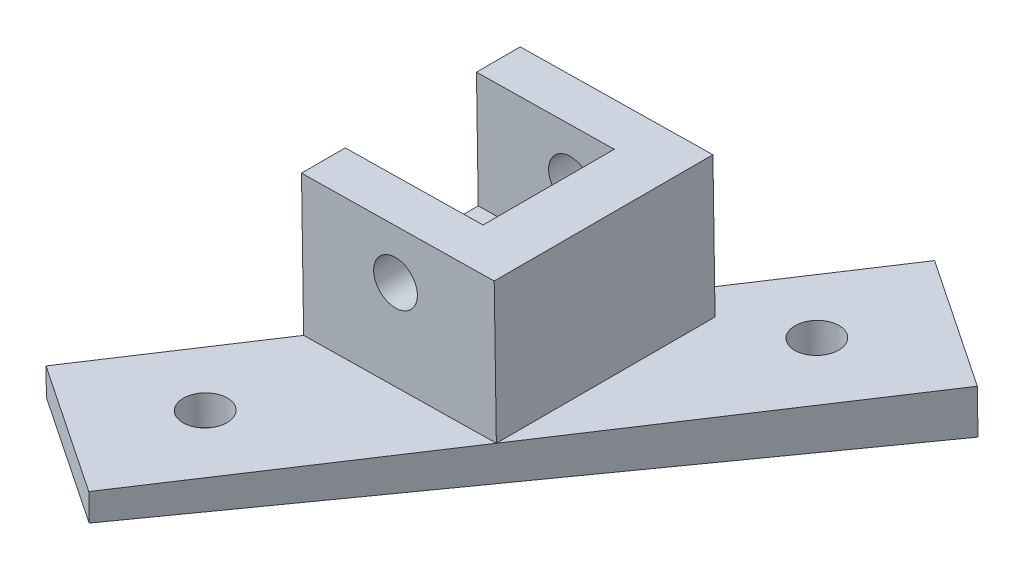
ISO-10303-21;
HEADER;
FILE_DESCRIPTION(('STEP AP214'),'2;1');
FILE_NAME('part.step','',(''),(''),'','','');
FILE_SCHEMA(('AUTOMOTIVE_DESIGN { 1 0 10303 214 1 1 1 1 }'));
ENDSEC;
DATA;
#1=APPLICATION_CONTEXT('core data for automotive mechanical design processes');
#2=APPLICATION_PROTOCOL_DEFINITION('international standard','automotive_design',2000,#1);
#3=PRODUCT_CONTEXT('',#1,'mechanical');
#4=PRODUCT('Part','Part','',(#3));
#5=PRODUCT_RELATED_PRODUCT_CATEGORY('part','',(#4));
#6=PRODUCT_DEFINITION_FORMATION('','',#4);
#7=PRODUCT_DEFINITION_CONTEXT('part definition',#1,'design');
#8=PRODUCT_DEFINITION('design','',#6,#7);
#9=PRODUCT_DEFINITION_SHAPE('','',#8);
#10=(LENGTH_UNIT() NAMED_UNIT(*) SI_UNIT(.MILLI.,.METRE.));
#11=(NAMED_UNIT(*) PLANE_ANGLE_UNIT() SI_UNIT($,.RADIAN.));
#12=(NAMED_UNIT(*) SI_UNIT($,.STERADIAN.) SOLID_ANGLE_UNIT());
#13=UNCERTAINTY_MEASURE_WITH_UNIT(LENGTH_MEASURE(1.E-05),#10,'distance_accuracy_value','');
#14=(GEOMETRIC_REPRESENTATION_CONTEXT(3) GLOBAL_UNCERTAINTY_ASSIGNED_CONTEXT((#13)) GLOBAL_UNIT_ASSIGNED_CONTEXT((#10,
#11,#12)) REPRESENTATION_CONTEXT('',''));
#15=CARTESIAN_POINT('',(0.,0.,0.));
#16=DIRECTION('',(0.,0.,1.));
#17=DIRECTION('',(1.,0.,0.));
#18=AXIS2_PLACEMENT_3D('',#15,#16,#17);
#19=CARTESIAN_POINT('',(670.82874810373,83.3624792084025,-35.299010508258));
#20=DIRECTION('',(-0.560297095045979,-0.00855440103428425,0.828247539993921));
#21=DIRECTION('',(0.828277846314157,0.,0.560317596819145));
#22=AXIS2_PLACEMENT_3D('',#19,#20,#21);
#23=PLANE('',#22);
#24=DIRECTION('',(0.82815102457222,0.0126438920418868,0.560362393897035));
#25=VECTOR('',#24,1.);
#26=CARTESIAN_POINT('',(615.807262305805,84.0479670139401,-72.5131442445612));
#27=LINE('',#26,#25);
#28=CARTESIAN_POINT('',(651.613852575449,84.5946482934704,-48.2848742244251));
#29=VERTEX_POINT('',#28);
#30=CARTESIAN_POINT('',(670.805462252731,84.8876584252817,-35.299010508258));
#31=VERTEX_POINT('',#30);
#32=EDGE_CURVE('E50',#29,#31,#27,.T.);
#33=ORIENTED_EDGE('',*,*,#32,.F.);
#34=DIRECTION('',(-0.0152658371215683,0.999883470318906,0.));
#35=VECTOR('',#34,1.);
#36=CARTESIAN_POINT('',(651.637138426448,83.0694690765912,-48.2848742244251));
#37=LINE('',#36,#35);
#38=CARTESIAN_POINT('',(651.516935224953,90.9425515218822,-48.2848742244251));
#39=VERTEX_POINT('',#38);
#40=EDGE_CURVE('E178',#29,#39,#37,.T.);
#41=ORIENTED_EDGE('',*,*,#40,.T.);
#42=DIRECTION('',(0.828151024572218,0.0126438920418868,0.560362393897037));
#43=VECTOR('',#42,1.);
#44=CARTESIAN_POINT('',(670.708544902235,91.2355616536936,-35.299010508258));
#45=LINE('',#44,#43);
#46=CARTESIAN_POINT('',(670.708544902235,91.2355616536936,-35.299010508258));
#47=VERTEX_POINT('',#46);
#48=EDGE_CURVE('E175',#39,#47,#45,.T.);
#49=ORIENTED_EDGE('',*,*,#48,.T.);
#50=DIRECTION('',(-0.0152658371215683,0.999883470318906,0.));
#51=VECTOR('',#50,1.);
#52=CARTESIAN_POINT('',(670.82874810373,83.3624792084025,-35.299010508258));
#53=LINE('',#52,#51);
#54=EDGE_CURVE('E44',#31,#47,#53,.T.);
#55=ORIENTED_EDGE('',*,*,#54,.F.);
#56=EDGE_LOOP('',(#33,#41,#49,#55));
#57=FACE_BOUND('',#56,.T.);
#58=ADVANCED_FACE('F41',(#57),#23,.F.);
#59=CARTESIAN_POINT('',(618.777594974256,82.5677821769465,41.6445251882739));
#60=DIRECTION('',(-0.82815102457222,-0.0126438920418868,-0.560362393897035));
#61=DIRECTION('',(-0.560407191277623,0.,0.828217229936884));
#62=AXIS2_PLACEMENT_3D('',#59,#60,#61);
#63=PLANE('',#62);
#64=DIRECTION('',(-0.0152658371215683,0.999883470318906,0.));
#65=VECTOR('',#64,1.);
#66=CARTESIAN_POINT('',(618.777594974256,82.5677821769465,41.6445251882739));
#67=LINE('',#66,#65);
#68=CARTESIAN_POINT('',(618.717546662543,86.5008330685791,41.6445251882738));
#69=VERTEX_POINT('',#68);
#70=CARTESIAN_POINT('',(618.657391772761,90.4408646222376,41.6445251882739));
#71=VERTEX_POINT('',#70);
#72=EDGE_CURVE('E149',#69,#71,#67,.T.);
#73=ORIENTED_EDGE('',*,*,#72,.F.);
#74=DIRECTION('',(-0.560504532319102,0.0173589533915006,0.827969405223946));
#75=VECTOR('',#74,1.);
#76=CARTESIAN_POINT('',(618.717546662543,86.5008330685791,41.6445251882738));
#77=LINE('',#76,#75);
#78=EDGE_CURVE('E11',#31,#69,#77,.T.);
#79=ORIENTED_EDGE('',*,*,#78,.F.);
#80=ORIENTED_EDGE('',*,*,#54,.T.);
#81=DIRECTION('',(-0.560297095045977,-0.00855440103428422,0.828247539993922));
#82=VECTOR('',#81,1.);
#83=CARTESIAN_POINT('',(618.657391772761,90.4408646222376,41.6445251882739));
#84=LINE('',#83,#82);
#85=CARTESIAN_POINT('',(642.533611114339,90.8053975766938,6.35));
#86=VERTEX_POINT('',#85);
#87=EDGE_CURVE('E173',#47,#86,#84,.T.);
#88=ORIENTED_EDGE('',*,*,#87,.T.);
#89=EDGE_CURVE('E157',#86,#71,#84,.T.);
#90=ORIENTED_EDGE('',*,*,#89,.T.);
#91=EDGE_LOOP('',(#73,#79,#80,#88,#90));
#92=FACE_BOUND('',#91,.T.);
#93=ADVANCED_FACE('F154',(#92),#63,.F.);
#94=CARTESIAN_POINT('',(614.677461713889,82.5051829157451,6.35));
#95=DIRECTION('',(0.828151024572219,0.0126438920418868,0.560362393897037));
#96=DIRECTION('',(0.560407191277625,0.,-0.828217229936883));
#97=AXIS2_PLACEMENT_3D('',#94,#95,#96);
#98=PLANE('',#97);
#99=ORIENTED_EDGE('',*,*,#40,.F.);
#100=DIRECTION('',(-0.560504532319104,0.0173589533915005,0.827969405223946));
#101=VECTOR('',#100,1.);
#102=CARTESIAN_POINT('',(614.675063702372,85.7386510221069,6.28058473161884));
#103=LINE('',#102,#101);
#104=CARTESIAN_POINT('',(599.525936985262,86.2078229367678,28.6586614721068));
#105=VERTEX_POINT('',#104);
#106=EDGE_CURVE('E58',#29,#105,#103,.T.);
#107=ORIENTED_EDGE('',*,*,#106,.T.);
#108=DIRECTION('',(-0.0152658371215683,0.999883470318906,0.));
#109=VECTOR('',#108,1.);
#110=CARTESIAN_POINT('',(599.585985296975,82.2747720451352,28.6586614721068));
#111=LINE('',#110,#109);
#112=CARTESIAN_POINT('',(599.46578209548,90.1478544904263,28.6586614721068));
#113=VERTEX_POINT('',#112);
#114=EDGE_CURVE('E151',#105,#113,#111,.T.);
#115=ORIENTED_EDGE('',*,*,#114,.T.);
#116=DIRECTION('',(0.560297095045979,0.00855440103428426,-0.828247539993921));
#117=VECTOR('',#116,1.);
#118=CARTESIAN_POINT('',(614.557258512394,90.3782653610361,6.35));
#119=LINE('',#118,#117);
#120=CARTESIAN_POINT('',(614.557258512394,90.3782653610361,6.35));
#121=VERTEX_POINT('',#120);
#122=EDGE_CURVE('E168',#113,#121,#119,.T.);
#123=ORIENTED_EDGE('',*,*,#122,.T.);
#124=CARTESIAN_POINT('',(636.035659483969,90.7061893447772,-25.3999999999998));
#125=VERTEX_POINT('',#124);
#126=EDGE_CURVE('E170',#121,#125,#119,.T.);
#127=ORIENTED_EDGE('',*,*,#126,.T.);
#128=EDGE_CURVE('E171',#125,#39,#119,.T.);
#129=ORIENTED_EDGE('',*,*,#128,.T.);
#130=EDGE_LOOP('',(#99,#107,#115,#123,#127,#129));
#131=FACE_BOUND('',#130,.T.);
#132=ADVANCED_FACE('F197',(#131),#98,.F.);
#133=CARTESIAN_POINT('',(-1.23631912482259,80.9765653272119,-53.8768083630402));
#134=DIRECTION('',(-0.0152658371215682,0.999883470318906,0.));
#135=DIRECTION('',(-0.999883470318906,-0.0152658371215682,0.));
#136=AXIS2_PLACEMENT_3D('',#133,#134,#135);
#137=PLANE('',#136);
#138=ORIENTED_EDGE('',*,*,#126,.F.);
#139=DIRECTION('',(0.,0.,1.));
#140=VECTOR('',#139,1.);
#141=CARTESIAN_POINT('',(614.557258512394,90.3782653610361,-53.8768083630402));
#142=LINE('',#141,#140);
#143=CARTESIAN_POINT('',(614.557258512394,90.3782653610361,-25.3999999999998));
#144=VERTEX_POINT('',#143);
#145=EDGE_CURVE('E235',#144,#121,#142,.T.);
#146=ORIENTED_EDGE('',*,*,#145,.F.);
#147=DIRECTION('',(-0.999883470318906,-0.0152658371215682,0.));
#148=VECTOR('',#147,1.);
#149=CARTESIAN_POINT('',(642.533611114339,90.8053975766938,-25.3999999999998));
#150=LINE('',#149,#148);
#151=EDGE_CURVE('E245',#125,#144,#150,.T.);
#152=ORIENTED_EDGE('',*,*,#151,.F.);
#153=EDGE_LOOP('',(#138,#146,#152));
#154=FACE_BOUND('',#153,.T.);
#155=ADVANCED_FACE('F341',(#154),#137,.F.);
#156=CARTESIAN_POINT('',(-1.29060444162689,84.5321509476659,-53.8768083630402));
#157=DIRECTION('',(0.0152658371215682,-0.999883470318906,0.));
#158=DIRECTION('',(0.999883470318906,0.0152658371215682,0.));
#159=AXIS2_PLACEMENT_3D('',#156,#157,#158);
#160=PLANE('',#159);
#161=DIRECTION('',(0.,0.,1.));
#162=VECTOR('',#161,1.);
#163=CARTESIAN_POINT('',(623.884527878266,94.0770849582326,-53.8768083630402));
#164=LINE('',#163,#162);
#165=CARTESIAN_POINT('',(623.884527878265,94.0770849582326,-19.05));
#166=VERTEX_POINT('',#165);
#167=CARTESIAN_POINT('',(623.884527878266,94.0770849582326,0.));
#168=VERTEX_POINT('',#167);
#169=EDGE_CURVE('E547',#166,#168,#164,.T.);
#170=ORIENTED_EDGE('',*,*,#169,.F.);
#171=DIRECTION('',(-0.999883470318906,-0.0152658371215682,0.));
#172=VECTOR('',#171,1.);
#173=CARTESIAN_POINT('',(-1.29060444162688,84.5321509476659,-19.0499999999998));
#174=LINE('',#173,#172);
#175=CARTESIAN_POINT('',(614.50297319559,93.9338509814902,-19.0499999999999));
#176=VERTEX_POINT('',#175);
#177=EDGE_CURVE('E200',#166,#176,#174,.T.);
#178=ORIENTED_EDGE('',*,*,#177,.T.);
#179=DIRECTION('',(0.,0.,1.));
#180=VECTOR('',#179,1.);
#181=CARTESIAN_POINT('',(614.50297319559,93.9338509814902,-53.8768083630402));
#182=LINE('',#181,#180);
#183=CARTESIAN_POINT('',(614.50297319559,93.9338509814902,0.));
#184=VERTEX_POINT('',#183);
#185=EDGE_CURVE('E563',#176,#184,#182,.T.);
#186=ORIENTED_EDGE('',*,*,#185,.T.);
#187=DIRECTION('',(0.999883470318906,0.0152658371215682,0.));
#188=VECTOR('',#187,1.);
#189=CARTESIAN_POINT('',(-1.29060444162689,84.5321509476659,0.));
#190=LINE('',#189,#188);
#191=EDGE_CURVE('E236',#184,#168,#190,.T.);
#192=ORIENTED_EDGE('',*,*,#191,.T.);
#193=EDGE_LOOP('',(#170,#178,#186,#192));
#194=FACE_BOUND('',#193,.T.);
#195=ADVANCED_FACE('F345',(#194),#160,.F.);
#196=CARTESIAN_POINT('',(615.793577637217,9.40170003382415,-53.8768083630402));
#197=DIRECTION('',(0.999883470318906,0.0152658371215681,0.));
#198=DIRECTION('',(-0.0152658371215681,0.999883470318906,0.));
#199=AXIS2_PLACEMENT_3D('',#196,#197,#198);
#200=PLANE('',#199);
#201=ORIENTED_EDGE('',*,*,#185,.F.);
#202=DIRECTION('',(-0.0152658371215681,0.999883470318906,0.));
#203=VECTOR('',#202,1.);
#204=CARTESIAN_POINT('',(614.557258512394,90.3782653610361,-19.0499999999998));
#205=LINE('',#204,#203);
#206=CARTESIAN_POINT('',(614.248219958873,110.619706357478,-19.0499999999998));
#207=VERTEX_POINT('',#206);
#208=EDGE_CURVE('E233',#176,#207,#205,.T.);
#209=ORIENTED_EDGE('',*,*,#208,.T.);
#210=DIRECTION('',(0.,0.,1.));
#211=VECTOR('',#210,1.);
#212=CARTESIAN_POINT('',(614.248219958873,110.619706357478,-25.3999999999998));
#213=LINE('',#212,#211);
#214=CARTESIAN_POINT('',(614.248219958873,110.619706357478,-25.3999999999998));
#215=VERTEX_POINT('',#214);
#216=EDGE_CURVE('E225',#215,#207,#213,.T.);
#217=ORIENTED_EDGE('',*,*,#216,.F.);
#218=DIRECTION('',(-0.0152658371215681,0.999883470318906,0.));
#219=VECTOR('',#218,1.);
#220=CARTESIAN_POINT('',(614.557258512394,90.3782653610361,-25.3999999999998));
#221=LINE('',#220,#219);
#222=EDGE_CURVE('E243',#144,#215,#221,.T.);
#223=ORIENTED_EDGE('',*,*,#222,.F.);
#224=ORIENTED_EDGE('',*,*,#145,.T.);
#225=DIRECTION('',(-0.0152658371215681,0.999883470318906,0.));
#226=VECTOR('',#225,1.);
#227=CARTESIAN_POINT('',(614.557258512394,90.3782653610361,6.35));
#228=LINE('',#227,#226);
#229=CARTESIAN_POINT('',(614.248219958873,110.619706357478,6.35));
#230=VERTEX_POINT('',#229);
#231=EDGE_CURVE('E221',#121,#230,#228,.T.);
#232=ORIENTED_EDGE('',*,*,#231,.T.);
#233=DIRECTION('',(0.,0.,-1.));
#234=VECTOR('',#233,1.);
#235=CARTESIAN_POINT('',(614.248219958873,110.619706357478,6.35));
#236=LINE('',#235,#234);
#237=CARTESIAN_POINT('',(614.248219958873,110.619706357478,0.));
#238=VERTEX_POINT('',#237);
#239=EDGE_CURVE('E587',#230,#238,#236,.T.);
#240=ORIENTED_EDGE('',*,*,#239,.T.);
#241=DIRECTION('',(-0.0152658371215681,0.999883470318906,0.));
#242=VECTOR('',#241,1.);
#243=CARTESIAN_POINT('',(614.557258512394,90.3782653610361,0.));
#244=LINE('',#243,#242);
#245=EDGE_CURVE('E592',#184,#238,#244,.T.);
#246=ORIENTED_EDGE('',*,*,#245,.F.);
#247=EDGE_LOOP('',(#201,#209,#217,#223,#224,#232,#240,#246));
#248=FACE_BOUND('',#247,.T.);
#249=ADVANCED_FACE('F378',(#248),#200,.F.);
#250=CARTESIAN_POINT('',(643.769930239162,9.82883224948189,-53.8768083630402));
#251=DIRECTION('',(-0.999883470318906,-0.0152658371215681,0.));
#252=DIRECTION('',(0.0152658371215681,-0.999883470318906,0.));
#253=AXIS2_PLACEMENT_3D('',#250,#251,#252);
#254=PLANE('',#253);
#255=DIRECTION('',(0.,0.,1.));
#256=VECTOR('',#255,1.);
#257=CARTESIAN_POINT('',(642.533611114339,90.8053975766938,-53.8768083630402));
#258=LINE('',#257,#256);
#259=CARTESIAN_POINT('',(642.533611114339,90.8053975766938,-25.3999999999998));
#260=VERTEX_POINT('',#259);
#261=EDGE_CURVE('E152',#260,#86,#258,.T.);
#262=ORIENTED_EDGE('',*,*,#261,.F.);
#263=DIRECTION('',(0.0152658371215681,-0.999883470318906,0.));
#264=VECTOR('',#263,1.);
#265=CARTESIAN_POINT('',(642.224572560817,111.046838573136,-25.3999999999998));
#266=LINE('',#265,#264);
#267=CARTESIAN_POINT('',(642.224572560817,111.046838573136,-25.3999999999998));
#268=VERTEX_POINT('',#267);
#269=EDGE_CURVE('E237',#268,#260,#266,.T.);
#270=ORIENTED_EDGE('',*,*,#269,.F.);
#271=DIRECTION('',(0.,0.,1.));
#272=VECTOR('',#271,1.);
#273=CARTESIAN_POINT('',(642.224572560818,111.046838573136,-53.8768083630402));
#274=LINE('',#273,#272);
#275=CARTESIAN_POINT('',(642.224572560817,111.046838573136,6.35));
#276=VERTEX_POINT('',#275);
#277=EDGE_CURVE('E226',#268,#276,#274,.T.);
#278=ORIENTED_EDGE('',*,*,#277,.T.);
#279=DIRECTION('',(0.0152658371215681,-0.999883470318906,0.));
#280=VECTOR('',#279,1.);
#281=CARTESIAN_POINT('',(642.224572560817,111.046838573136,6.35));
#282=LINE('',#281,#280);
#283=EDGE_CURVE('E223',#276,#86,#282,.T.);
#284=ORIENTED_EDGE('',*,*,#283,.T.);
#285=EDGE_LOOP('',(#262,#270,#278,#284));
#286=FACE_BOUND('',#285,.T.);
#287=ADVANCED_FACE('F389',(#286),#254,.F.);
#288=CARTESIAN_POINT('',(-1.54535767834411,101.218006323654,-53.8768083630402));
#289=DIRECTION('',(0.0152658371215673,-0.999883470318906,0.));
#290=DIRECTION('',(0.999883470318906,0.0152658371215673,0.));
#291=AXIS2_PLACEMENT_3D('',#288,#289,#290);
#292=PLANE('',#291);
#293=ORIENTED_EDGE('',*,*,#277,.F.);
#294=DIRECTION('',(0.999883470318906,0.0152658371215677,0.));
#295=VECTOR('',#294,1.);
#296=CARTESIAN_POINT('',(614.248219958873,110.619706357478,-25.3999999999998));
#297=LINE('',#296,#295);
#298=EDGE_CURVE('E240',#215,#268,#297,.T.);
#299=ORIENTED_EDGE('',*,*,#298,.F.);
#300=ORIENTED_EDGE('',*,*,#216,.T.);
#301=DIRECTION('',(0.999883470318906,0.0152658371215677,0.));
#302=VECTOR('',#301,1.);
#303=CARTESIAN_POINT('',(614.248219958873,110.619706357478,-19.0499999999998));
#304=LINE('',#303,#302);
#305=CARTESIAN_POINT('',(634.25254540357,110.925124721748,-19.05));
#306=VERTEX_POINT('',#305);
#307=EDGE_CURVE('E229',#207,#306,#304,.T.);
#308=ORIENTED_EDGE('',*,*,#307,.T.);
#309=DIRECTION('',(0.,0.,1.));
#310=VECTOR('',#309,1.);
#311=CARTESIAN_POINT('',(634.25254540357,110.925124721748,-53.8768083630402));
#312=LINE('',#311,#310);
#313=CARTESIAN_POINT('',(634.25254540357,110.925124721748,0.));
#314=VERTEX_POINT('',#313);
#315=EDGE_CURVE('E232',#306,#314,#312,.T.);
#316=ORIENTED_EDGE('',*,*,#315,.T.);
#317=DIRECTION('',(0.999883470318906,0.0152658371215682,0.));
#318=VECTOR('',#317,1.);
#319=CARTESIAN_POINT('',(614.248219958873,110.619706357478,0.));
#320=LINE('',#319,#318);
#321=EDGE_CURVE('E594',#238,#314,#320,.T.);
#322=ORIENTED_EDGE('',*,*,#321,.F.);
#323=ORIENTED_EDGE('',*,*,#239,.F.);
#324=DIRECTION('',(0.999883470318906,0.0152658371215682,0.));
#325=VECTOR('',#324,1.);
#326=CARTESIAN_POINT('',(614.248219958873,110.619706357478,6.35));
#327=LINE('',#326,#325);
#328=EDGE_CURVE('E283',#230,#276,#327,.T.);
#329=ORIENTED_EDGE('',*,*,#328,.T.);
#330=EDGE_LOOP('',(#293,#299,#300,#308,#316,#322,#323,#329));
#331=FACE_BOUND('',#330,.T.);
#332=ADVANCED_FACE('F400',(#331),#292,.F.);
#333=CARTESIAN_POINT('',(627.893070479448,103.664395922966,-53.8768083630402));
#334=DIRECTION('',(0.,0.,1.));
#335=DIRECTION('',(1.,0.,0.));
#336=AXIS2_PLACEMENT_3D('',#333,#334,#335);
#337=CYLINDRICAL_SURFACE('',#336,9.65200000000007);
#338=CARTESIAN_POINT('',(627.893070479448,103.664395922966,-19.05));
#339=DIRECTION('',(0.,0.,1.));
#340=DIRECTION('',(1.,0.,0.));
#341=AXIS2_PLACEMENT_3D('',#338,#339,#340);
#342=CIRCLE('',#341,9.65200000000007);
#343=CARTESIAN_POINT('',(630.810820972356,94.463970059935,-19.05));
#344=VERTEX_POINT('',#343);
#345=EDGE_CURVE('E251',#344,#306,#342,.T.);
#346=ORIENTED_EDGE('',*,*,#345,.F.);
#347=DIRECTION('',(0.,0.,1.));
#348=VECTOR('',#347,1.);
#349=CARTESIAN_POINT('',(630.810820972356,94.4639700599349,-53.8768083630402));
#350=LINE('',#349,#348);
#351=CARTESIAN_POINT('',(630.810820972356,94.4639700599349,0.));
#352=VERTEX_POINT('',#351);
#353=EDGE_CURVE('E275',#344,#352,#350,.T.);
#354=ORIENTED_EDGE('',*,*,#353,.T.);
#355=CARTESIAN_POINT('',(627.893070479448,103.664395922966,0.));
#356=DIRECTION('',(0.,0.,1.));
#357=DIRECTION('',(1.,0.,0.));
#358=AXIS2_PLACEMENT_3D('',#355,#356,#357);
#359=CIRCLE('',#358,9.65200000000007);
#360=EDGE_CURVE('E252',#314,#352,#359,.F.);
#361=ORIENTED_EDGE('',*,*,#360,.F.);
#362=ORIENTED_EDGE('',*,*,#315,.F.);
#363=EDGE_LOOP('',(#346,#354,#361,#362));
#364=FACE_BOUND('',#363,.T.);
#365=ADVANCED_FACE('F286',(#364),#337,.F.);
#366=CARTESIAN_POINT('',(-1.29489573492162,84.8132225466757,-53.8768083630402));
#367=DIRECTION('',(0.0152658371213527,-0.999883470318909,0.));
#368=DIRECTION('',(0.999883470318909,0.0152658371213527,0.));
#369=AXIS2_PLACEMENT_3D('',#366,#367,#368);
#370=PLANE('',#369);
#371=ORIENTED_EDGE('',*,*,#353,.F.);
#372=DIRECTION('',(-0.999883470318909,-0.0152658371213527,0.));
#373=VECTOR('',#372,1.);
#374=CARTESIAN_POINT('',(-1.29489573492161,84.8132225466757,-19.0499999999998));
#375=LINE('',#374,#373);
#376=CARTESIAN_POINT('',(628.03418628472,94.4215774670526,-19.05));
#377=VERTEX_POINT('',#376);
#378=EDGE_CURVE('E265',#344,#377,#375,.T.);
#379=ORIENTED_EDGE('',*,*,#378,.T.);
#380=DIRECTION('',(0.,0.,1.));
#381=VECTOR('',#380,1.);
#382=CARTESIAN_POINT('',(628.03418628472,94.4215774670526,-53.8768083630402));
#383=LINE('',#382,#381);
#384=CARTESIAN_POINT('',(628.03418628472,94.4215774670526,0.));
#385=VERTEX_POINT('',#384);
#386=EDGE_CURVE('E274',#377,#385,#383,.T.);
#387=ORIENTED_EDGE('',*,*,#386,.T.);
#388=DIRECTION('',(0.999883470318909,0.0152658371213527,0.));
#389=VECTOR('',#388,1.);
#390=CARTESIAN_POINT('',(-1.29489573492162,84.8132225466757,0.));
#391=LINE('',#390,#389);
#392=EDGE_CURVE('E280',#385,#352,#391,.T.);
#393=ORIENTED_EDGE('',*,*,#392,.T.);
#394=EDGE_LOOP('',(#371,#379,#387,#393));
#395=FACE_BOUND('',#394,.T.);
#396=ADVANCED_FACE('F279',(#395),#370,.F.);
#397=CARTESIAN_POINT('',(623.884527878266,94.0770849582326,-53.8768083630402));
#398=CARTESIAN_POINT('',(624.2014691757,94.0819238963363,-53.8768083630402));
#399=CARTESIAN_POINT('',(624.526518619728,94.1078590761953,-53.8768083630402));
#400=CARTESIAN_POINT('',(625.19407181114,94.1761616374886,-53.8768083630402));
#401=CARTESIAN_POINT('',(625.538291649457,94.2189712483052,-53.8768083630402));
#402=CARTESIAN_POINT('',(626.237801829782,94.3006977426931,-53.8768083630402));
#403=CARTESIAN_POINT('',(626.591177817197,94.3392819538361,-53.8768083630402));
#404=CARTESIAN_POINT('',(627.30622806958,94.3969858185991,-53.8768083630402));
#405=CARTESIAN_POINT('',(627.667912536219,94.4159853400167,-53.8768083630402));
#406=CARTESIAN_POINT('',(628.03418628472,94.421577467052,-53.8768083630402));
#407=B_SPLINE_CURVE_WITH_KNOTS('',3,(#397,#398,#399,#400,#401,#402,#403,#404,#405,#406),
.UNSPECIFIED.,.F.,.F.,(4,2,2,2,4),(0.,0.25,0.5,0.75,1.),.UNSPECIFIED.);
#408=DIRECTION('',(0.,0.,1.));
#409=VECTOR('',#408,1.);
#410=SURFACE_OF_LINEAR_EXTRUSION('',#407,#409);
#411=ORIENTED_EDGE('',*,*,#386,.F.);
#412=CARTESIAN_POINT('',(623.884527878266,94.0770849582326,-19.05));
#413=CARTESIAN_POINT('',(624.2014691757,94.0819238963363,-19.05));
#414=CARTESIAN_POINT('',(624.526518619728,94.1078590761953,-19.05));
#415=CARTESIAN_POINT('',(625.19407181114,94.1761616374886,-19.05));
#416=CARTESIAN_POINT('',(625.538291649457,94.2189712483052,-19.05));
#417=CARTESIAN_POINT('',(626.237801829782,94.3006977426931,-19.05));
#418=CARTESIAN_POINT('',(626.591177817197,94.3392819538361,-19.05));
#419=CARTESIAN_POINT('',(627.30622806958,94.3969858185991,-19.05));
#420=CARTESIAN_POINT('',(627.667912536219,94.4159853400167,-19.05));
#421=CARTESIAN_POINT('',(628.03418628472,94.421577467052,-19.05));
#422=B_SPLINE_CURVE_WITH_KNOTS('',3,(#412,#413,#414,#415,#416,#417,#418,#419,#420,#421),
.UNSPECIFIED.,.F.,.F.,(4,2,2,2,4),(0.,0.25,0.5,0.75,1.),.UNSPECIFIED.);
#423=EDGE_CURVE('E270',#377,#166,#422,.F.);
#424=ORIENTED_EDGE('',*,*,#423,.T.);
#425=ORIENTED_EDGE('',*,*,#169,.T.);
#426=CARTESIAN_POINT('',(623.884527878266,94.0770849582326,0.));
#427=CARTESIAN_POINT('',(624.2014691757,94.0819238963363,0.));
#428=CARTESIAN_POINT('',(624.526518619728,94.1078590761953,0.));
#429=CARTESIAN_POINT('',(625.19407181114,94.1761616374886,0.));
#430=CARTESIAN_POINT('',(625.538291649457,94.2189712483052,0.));
#431=CARTESIAN_POINT('',(626.237801829782,94.3006977426931,0.));
#432=CARTESIAN_POINT('',(626.591177817197,94.3392819538361,0.));
#433=CARTESIAN_POINT('',(627.30622806958,94.3969858185991,0.));
#434=CARTESIAN_POINT('',(627.667912536219,94.4159853400167,0.));
#435=CARTESIAN_POINT('',(628.03418628472,94.421577467052,0.));
#436=B_SPLINE_CURVE_WITH_KNOTS('',3,(#426,#427,#428,#429,#430,#431,#432,#433,#434,#435),
.UNSPECIFIED.,.F.,.F.,(4,2,2,2,4),(0.,0.25,0.5,0.75,1.),.UNSPECIFIED.);
#437=EDGE_CURVE('E553',#168,#385,#436,.T.);
#438=ORIENTED_EDGE('',*,*,#437,.T.);
#439=EDGE_LOOP('',(#411,#424,#425,#438));
#440=FACE_BOUND('',#439,.T.);
#441=ADVANCED_FACE('F307',(#440),#410,.F.);
#442=CARTESIAN_POINT('',(0.,0.,0.));
#443=DIRECTION('',(0.,0.,-1.));
#444=DIRECTION('',(-1.,0.,0.));
#445=AXIS2_PLACEMENT_3D('',#442,#443,#444);
#446=PLANE('',#445);
#447=CARTESIAN_POINT('',(627.893070479448,103.664395922966,0.));
#448=DIRECTION('',(0.,0.,-1.));
#449=DIRECTION('',(-1.,0.,0.));
#450=AXIS2_PLACEMENT_3D('',#447,#448,#449);
#451=CIRCLE('',#450,3.17500000000009);
#452=CARTESIAN_POINT('',(624.718070479448,103.664395922966,0.));
#453=VERTEX_POINT('',#452);
#454=EDGE_CURVE('E239',#453,#453,#451,.T.);
#455=ORIENTED_EDGE('',*,*,#454,.F.);
#456=EDGE_LOOP('',(#455));
#457=FACE_BOUND('',#456,.T.);
#458=ORIENTED_EDGE('',*,*,#191,.F.);
#459=ORIENTED_EDGE('',*,*,#245,.T.);
#460=ORIENTED_EDGE('',*,*,#321,.T.);
#461=ORIENTED_EDGE('',*,*,#360,.T.);
#462=ORIENTED_EDGE('',*,*,#392,.F.);
#463=ORIENTED_EDGE('',*,*,#437,.F.);
#464=EDGE_LOOP('',(#458,#459,#460,#461,#462,#463));
#465=FACE_BOUND('',#464,.T.);
#466=ADVANCED_FACE('F297',(#457,#465),#446,.T.);
#467=CARTESIAN_POINT('',(0.,0.,6.35));
#468=DIRECTION('',(0.,0.,-1.));
#469=DIRECTION('',(-1.,0.,0.));
#470=AXIS2_PLACEMENT_3D('',#467,#468,#469);
#471=PLANE('',#470);
#472=CARTESIAN_POINT('',(627.893070479448,103.664395922966,6.35));
#473=DIRECTION('',(0.,0.,-1.));
#474=DIRECTION('',(-1.,0.,0.));
#475=AXIS2_PLACEMENT_3D('',#472,#473,#474);
#476=CIRCLE('',#475,3.17500000000009);
#477=CARTESIAN_POINT('',(624.718070479448,103.664395922966,6.35));
#478=VERTEX_POINT('',#477);
#479=EDGE_CURVE('E249',#478,#478,#476,.T.);
#480=ORIENTED_EDGE('',*,*,#479,.T.);
#481=EDGE_LOOP('',(#480));
#482=FACE_BOUND('',#481,.T.);
#483=ORIENTED_EDGE('',*,*,#283,.F.);
#484=ORIENTED_EDGE('',*,*,#328,.F.);
#485=ORIENTED_EDGE('',*,*,#231,.F.);
#486=DIRECTION('',(-0.999883470318906,-0.0152658371215682,0.));
#487=VECTOR('',#486,1.);
#488=CARTESIAN_POINT('',(642.533611114339,90.8053975766938,6.35));
#489=LINE('',#488,#487);
#490=EDGE_CURVE('E161',#86,#121,#489,.T.);
#491=ORIENTED_EDGE('',*,*,#490,.F.);
#492=EDGE_LOOP('',(#483,#484,#485,#491));
#493=FACE_BOUND('',#492,.T.);
#494=ADVANCED_FACE('F262',(#482,#493),#471,.F.);
#495=CARTESIAN_POINT('',(0.,0.,-19.0499999999998));
#496=DIRECTION('',(0.,0.,-1.));
#497=DIRECTION('',(-1.,0.,0.));
#498=AXIS2_PLACEMENT_3D('',#495,#496,#497);
#499=PLANE('',#498);
#500=CARTESIAN_POINT('',(627.893070479448,103.664395922966,-19.0499999999998));
#501=DIRECTION('',(0.,0.,1.));
#502=DIRECTION('',(1.,0.,0.));
#503=AXIS2_PLACEMENT_3D('',#500,#501,#502);
#504=CIRCLE('',#503,3.17500000000009);
#505=CARTESIAN_POINT('',(631.068070479448,103.664395922966,-19.0499999999998));
#506=VERTEX_POINT('',#505);
#507=EDGE_CURVE('E209',#506,#506,#504,.T.);
#508=ORIENTED_EDGE('',*,*,#507,.F.);
#509=EDGE_LOOP('',(#508));
#510=FACE_BOUND('',#509,.T.);
#511=ORIENTED_EDGE('',*,*,#378,.F.);
#512=ORIENTED_EDGE('',*,*,#345,.T.);
#513=ORIENTED_EDGE('',*,*,#307,.F.);
#514=ORIENTED_EDGE('',*,*,#208,.F.);
#515=ORIENTED_EDGE('',*,*,#177,.F.);
#516=ORIENTED_EDGE('',*,*,#423,.F.);
#517=EDGE_LOOP('',(#511,#512,#513,#514,#515,#516));
#518=FACE_BOUND('',#517,.T.);
#519=ADVANCED_FACE('F258',(#510,#518),#499,.F.);
#520=CARTESIAN_POINT('',(0.,0.,-25.3999999999998));
#521=DIRECTION('',(0.,0.,-1.));
#522=DIRECTION('',(-1.,0.,0.));
#523=AXIS2_PLACEMENT_3D('',#520,#521,#522);
#524=PLANE('',#523);
#525=CARTESIAN_POINT('',(627.893070479448,103.664395922966,-25.3999999999998));
#526=DIRECTION('',(0.,0.,1.));
#527=DIRECTION('',(1.,0.,0.));
#528=AXIS2_PLACEMENT_3D('',#525,#526,#527);
#529=CIRCLE('',#528,3.17500000000009);
#530=CARTESIAN_POINT('',(631.068070479448,103.664395922966,-25.3999999999998));
#531=VERTEX_POINT('',#530);
#532=EDGE_CURVE('E165',#531,#531,#529,.T.);
#533=ORIENTED_EDGE('',*,*,#532,.T.);
#534=EDGE_LOOP('',(#533));
#535=FACE_BOUND('',#534,.T.);
#536=EDGE_CURVE('E204',#260,#125,#150,.T.);
#537=ORIENTED_EDGE('',*,*,#536,.T.);
#538=ORIENTED_EDGE('',*,*,#151,.T.);
#539=ORIENTED_EDGE('',*,*,#222,.T.);
#540=ORIENTED_EDGE('',*,*,#298,.T.);
#541=ORIENTED_EDGE('',*,*,#269,.T.);
#542=EDGE_LOOP('',(#537,#538,#539,#540,#541));
#543=FACE_BOUND('',#542,.T.);
#544=ADVANCED_FACE('F261',(#535,#543),#524,.T.);
#545=CARTESIAN_POINT('',(627.893070479448,103.664395922966,6.35));
#546=DIRECTION('',(0.,0.,-1.));
#547=DIRECTION('',(-1.,0.,0.));
#548=AXIS2_PLACEMENT_3D('',#545,#546,#547);
#549=CYLINDRICAL_SURFACE('',#548,3.17500000000009);
#550=ORIENTED_EDGE('',*,*,#479,.F.);
#551=EDGE_LOOP('',(#550));
#552=FACE_BOUND('',#551,.T.);
#553=ORIENTED_EDGE('',*,*,#454,.T.);
#554=EDGE_LOOP('',(#553));
#555=FACE_BOUND('',#554,.T.);
#556=ADVANCED_FACE('F315',(#552,#555),#549,.F.);
#557=CARTESIAN_POINT('',(627.893070479448,103.664395922966,-25.3999999999998));
#558=DIRECTION('',(0.,0.,1.));
#559=DIRECTION('',(1.,0.,0.));
#560=AXIS2_PLACEMENT_3D('',#557,#558,#559);
#561=CYLINDRICAL_SURFACE('',#560,3.17500000000009);
#562=ORIENTED_EDGE('',*,*,#532,.F.);
#563=EDGE_LOOP('',(#562));
#564=FACE_BOUND('',#563,.T.);
#565=ORIENTED_EDGE('',*,*,#507,.T.);
#566=EDGE_LOOP('',(#565));
#567=FACE_BOUND('',#566,.T.);
#568=ADVANCED_FACE('F256',(#564,#567),#561,.F.);
#569=CARTESIAN_POINT('',(-1.23631912482258,80.976565327212,0.));
#570=DIRECTION('',(-0.0152658371215681,0.999883470318906,0.));
#571=DIRECTION('',(-0.999883470318906,-0.0152658371215681,0.));
#572=AXIS2_PLACEMENT_3D('',#569,#570,#571);
#573=PLANE('',#572);
#574=CARTESIAN_POINT('',(652.710096628816,90.9607682523231,-29.9972488825689));
#575=DIRECTION('',(-0.0152658371215681,0.999883470318906,0.));
#576=DIRECTION('',(-0.999883470318906,-0.0152658371215681,0.));
#577=AXIS2_PLACEMENT_3D('',#574,#575,#576);
#578=CIRCLE('',#577,3.17500000000007);
#579=CARTESIAN_POINT('',(649.535466610553,90.9122992194622,-29.9972488825689));
#580=VERTEX_POINT('',#579);
#581=EDGE_CURVE('E179',#580,#580,#578,.T.);
#582=ORIENTED_EDGE('',*,*,#581,.F.);
#583=EDGE_LOOP('',(#582));
#584=FACE_BOUND('',#583,.T.);
#585=ORIENTED_EDGE('',*,*,#536,.F.);
#586=ORIENTED_EDGE('',*,*,#261,.T.);
#587=ORIENTED_EDGE('',*,*,#87,.F.);
#588=ORIENTED_EDGE('',*,*,#48,.F.);
#589=ORIENTED_EDGE('',*,*,#128,.F.);
#590=EDGE_LOOP('',(#585,#586,#587,#588,#589));
#591=FACE_BOUND('',#590,.T.);
#592=ADVANCED_FACE('F202',(#584,#591),#573,.T.);
#593=CARTESIAN_POINT('',(599.585985296975,82.2747720451352,28.6586614721068));
#594=DIRECTION('',(0.560297095045977,0.0085544010342842,-0.828247539993923));
#595=DIRECTION('',(-0.828277846314159,0.,-0.560317596819142));
#596=AXIS2_PLACEMENT_3D('',#593,#594,#595);
#597=PLANE('',#596);
#598=ORIENTED_EDGE('',*,*,#114,.F.);
#599=DIRECTION('',(0.82815102457222,0.0126438920418868,0.560362393897035));
#600=VECTOR('',#599,1.);
#601=CARTESIAN_POINT('',(563.719346715618,85.6611416572376,4.43039145197056));
#602=LINE('',#601,#600);
#603=EDGE_CURVE('E142',#105,#69,#602,.T.);
#604=ORIENTED_EDGE('',*,*,#603,.T.);
#605=ORIENTED_EDGE('',*,*,#72,.T.);
#606=DIRECTION('',(-0.82815102457222,-0.0126438920418867,-0.560362393897035));
#607=VECTOR('',#606,1.);
#608=CARTESIAN_POINT('',(599.46578209548,90.1478544904263,28.6586614721068));
#609=LINE('',#608,#607);
#610=EDGE_CURVE('E159',#71,#113,#609,.T.);
#611=ORIENTED_EDGE('',*,*,#610,.T.);
#612=EDGE_LOOP('',(#598,#604,#605,#611));
#613=FACE_BOUND('',#612,.T.);
#614=ADVANCED_FACE('F147',(#613),#597,.F.);
#615=CARTESIAN_POINT('',(616.882906183494,90.4137724572159,22.9635510458991));
#616=DIRECTION('',(-0.0152658371215681,0.999883470318906,0.));
#617=DIRECTION('',(-0.999883470318906,-0.0152658371215681,0.));
#618=AXIS2_PLACEMENT_3D('',#615,#616,#617);
#619=CIRCLE('',#618,3.17500000000007);
#620=CARTESIAN_POINT('',(613.708276165231,90.3653034243549,22.9635510458991));
#621=VERTEX_POINT('',#620);
#622=EDGE_CURVE('E183',#621,#621,#619,.T.);
#623=ORIENTED_EDGE('',*,*,#622,.F.);
#624=EDGE_LOOP('',(#623));
#625=FACE_BOUND('',#624,.T.);
#626=ORIENTED_EDGE('',*,*,#89,.F.);
#627=ORIENTED_EDGE('',*,*,#490,.T.);
#628=ORIENTED_EDGE('',*,*,#122,.F.);
#629=ORIENTED_EDGE('',*,*,#610,.F.);
#630=EDGE_LOOP('',(#626,#627,#628,#629));
#631=FACE_BOUND('',#630,.T.);
#632=ADVANCED_FACE('F213',(#625,#631),#573,.T.);
#633=CARTESIAN_POINT('',(617.019712210432,81.4532363342251,22.9635510458991));
#634=DIRECTION('',(-0.0152658371215681,0.999883470318906,0.));
#635=DIRECTION('',(-0.999883470318906,-0.0152658371215681,0.));
#636=AXIS2_PLACEMENT_3D('',#633,#634,#635);
#637=CYLINDRICAL_SURFACE('',#636,3.17500000000007);
#638=CARTESIAN_POINT('',(616.948790367969,86.0984829327854,22.9635510458991));
#639=DIRECTION('',(-0.000741451095628498,0.999769372771133,-0.0214627938323036));
#640=DIRECTION('',(-0.560504532319098,0.0173589533915006,0.82796940522395));
#641=AXIS2_PLACEMENT_3D('',#638,#639,#640);
#642=ELLIPSE('',#641,3.17606655860611,3.17500000000007);
#643=CARTESIAN_POINT('',(615.168590666923,86.1536161241445,25.5932369853799));
#644=VERTEX_POINT('',#643);
#645=EDGE_CURVE('E186',#644,#644,#642,.F.);
#646=ORIENTED_EDGE('',*,*,#645,.T.);
#647=EDGE_LOOP('',(#646));
#648=FACE_BOUND('',#647,.T.);
#649=ORIENTED_EDGE('',*,*,#622,.T.);
#650=EDGE_LOOP('',(#649));
#651=FACE_BOUND('',#650,.T.);
#652=ADVANCED_FACE('F327',(#648,#651),#637,.F.);
#653=CARTESIAN_POINT('',(652.846902655754,82.0002321293323,-29.9972488825689));
#654=DIRECTION('',(-0.0152658371215681,0.999883470318906,0.));
#655=DIRECTION('',(-0.999883470318906,-0.0152658371215681,0.));
#656=AXIS2_PLACEMENT_3D('',#653,#654,#655);
#657=CYLINDRICAL_SURFACE('',#656,3.17500000000007);
#658=CARTESIAN_POINT('',(652.801284684619,84.9881229946833,-29.9972488825689));
#659=DIRECTION('',(-0.000741451095628498,0.999769372771133,-0.0214627938323036));
#660=DIRECTION('',(-0.560504532319098,0.0173589533915006,0.82796940522395));
#661=AXIS2_PLACEMENT_3D('',#658,#659,#660);
#662=ELLIPSE('',#661,3.17606655860611,3.17500000000007);
#663=CARTESIAN_POINT('',(651.021084983573,85.0432561860425,-27.3675629430881));
#664=VERTEX_POINT('',#663);
#665=EDGE_CURVE('E182',#664,#664,#662,.F.);
#666=ORIENTED_EDGE('',*,*,#665,.T.);
#667=EDGE_LOOP('',(#666));
#668=FACE_BOUND('',#667,.T.);
#669=ORIENTED_EDGE('',*,*,#581,.T.);
#670=EDGE_LOOP('',(#669));
#671=FACE_BOUND('',#670,.T.);
#672=ADVANCED_FACE('F329',(#668,#671),#657,.F.);
#673=CARTESIAN_POINT('',(563.719346715618,85.6611416572376,4.43039145197056));
#674=DIRECTION('',(-0.000741451095628498,0.999769372771133,-0.0214627938323036));
#675=DIRECTION('',(0.,0.0214627997318885,0.999769647582716));
#676=AXIS2_PLACEMENT_3D('',#673,#674,#675);
#677=PLANE('',#676);
#678=ORIENTED_EDGE('',*,*,#665,.F.);
#679=EDGE_LOOP('',(#678));
#680=FACE_BOUND('',#679,.T.);
#681=ORIENTED_EDGE('',*,*,#645,.F.);
#682=EDGE_LOOP('',(#681));
#683=FACE_BOUND('',#682,.T.);
#684=ORIENTED_EDGE('',*,*,#32,.T.);
#685=ORIENTED_EDGE('',*,*,#78,.T.);
#686=ORIENTED_EDGE('',*,*,#603,.F.);
#687=ORIENTED_EDGE('',*,*,#106,.F.);
#688=EDGE_LOOP('',(#684,#685,#686,#687));
#689=FACE_BOUND('',#688,.T.);
#690=ADVANCED_FACE('F141',(#680,#683,#689),#677,.F.);
#691=CLOSED_SHELL('',(#58,#93,#132,#155,#195,#249,#287,#332,#365,#396,#441,#466,#494,#519,#544,
#556,#568,#592,#614,#632,#652,#672,#690));
#692=MANIFOLD_SOLID_BREP('B2',#691);
#693=ADVANCED_BREP_SHAPE_REPRESENTATION('',(#18,#692),#14);
#694=SHAPE_DEFINITION_REPRESENTATION(#9,#693);
ENDSEC;
END-ISO-10303-21;
